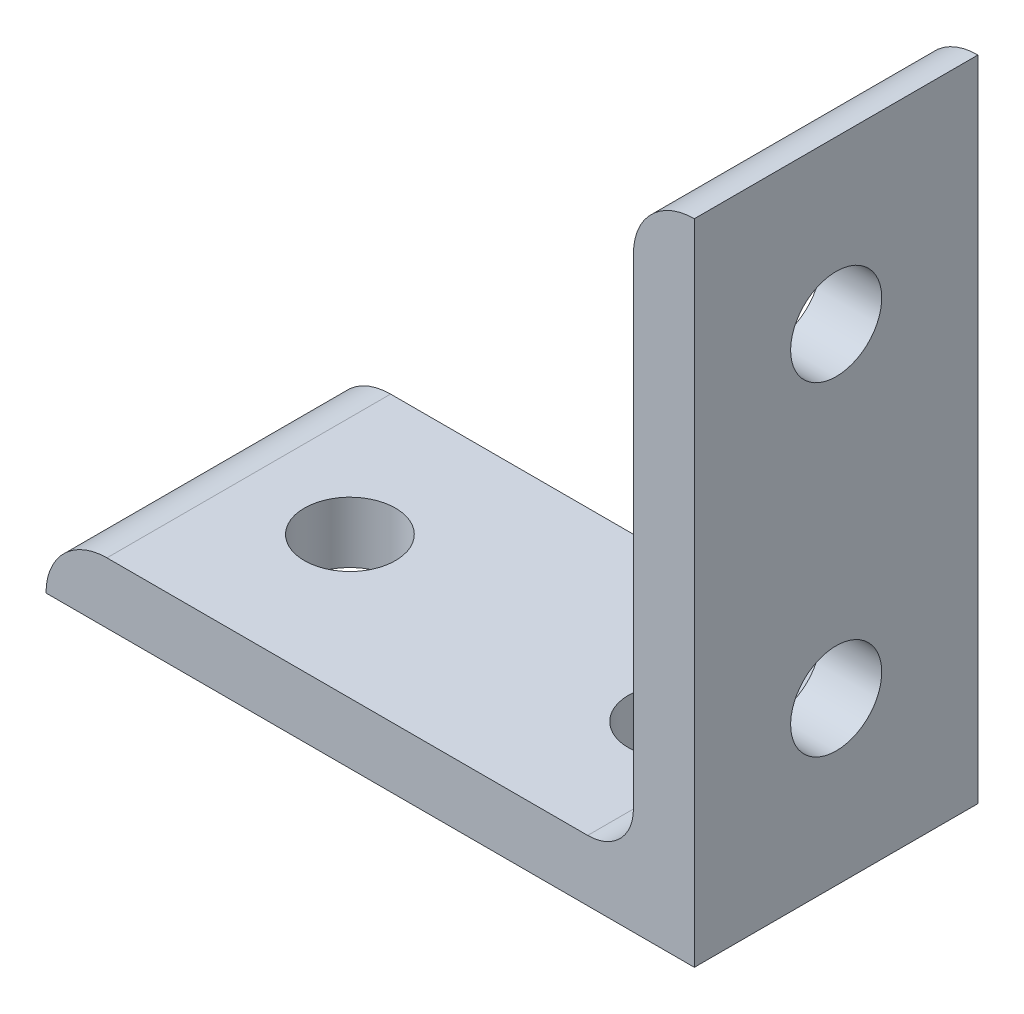
ISO-10303-21;
HEADER;
FILE_DESCRIPTION(('STEP AP214'),'2;1');
FILE_NAME('part.step','',(''),(''),'','','');
FILE_SCHEMA(('AUTOMOTIVE_DESIGN { 1 0 10303 214 1 1 1 1 }'));
ENDSEC;
DATA;
#1=APPLICATION_CONTEXT('core data for automotive mechanical design processes');
#2=APPLICATION_PROTOCOL_DEFINITION('international standard','automotive_design',2000,#1);
#3=PRODUCT_CONTEXT('',#1,'mechanical');
#4=PRODUCT('Part','Part','',(#3));
#5=PRODUCT_RELATED_PRODUCT_CATEGORY('part','',(#4));
#6=PRODUCT_DEFINITION_FORMATION('','',#4);
#7=PRODUCT_DEFINITION_CONTEXT('part definition',#1,'design');
#8=PRODUCT_DEFINITION('design','',#6,#7);
#9=PRODUCT_DEFINITION_SHAPE('','',#8);
#10=(LENGTH_UNIT() NAMED_UNIT(*) SI_UNIT(.MILLI.,.METRE.));
#11=(NAMED_UNIT(*) PLANE_ANGLE_UNIT() SI_UNIT($,.RADIAN.));
#12=(NAMED_UNIT(*) SI_UNIT($,.STERADIAN.) SOLID_ANGLE_UNIT());
#13=UNCERTAINTY_MEASURE_WITH_UNIT(LENGTH_MEASURE(1.E-05),#10,'distance_accuracy_value','');
#14=(GEOMETRIC_REPRESENTATION_CONTEXT(3) GLOBAL_UNCERTAINTY_ASSIGNED_CONTEXT((#13)) GLOBAL_UNIT_ASSIGNED_CONTEXT((#10,
#11,#12)) REPRESENTATION_CONTEXT('',''));
#15=CARTESIAN_POINT('',(0.,0.,0.));
#16=DIRECTION('',(0.,0.,1.));
#17=DIRECTION('',(1.,0.,0.));
#18=AXIS2_PLACEMENT_3D('',#15,#16,#17);
#19=CARTESIAN_POINT('',(0.,0.,-11.1125));
#20=DIRECTION('',(0.,-1.,0.));
#21=DIRECTION('',(1.,0.,0.));
#22=AXIS2_PLACEMENT_3D('',#19,#20,#21);
#23=PLANE('',#22);
#24=CARTESIAN_POINT('',(-38.1,0.,0.));
#25=DIRECTION('',(0.,1.,0.));
#26=DIRECTION('',(-1.,0.,0.));
#27=AXIS2_PLACEMENT_3D('',#24,#25,#26);
#28=CIRCLE('',#27,3.5687);
#29=CARTESIAN_POINT('',(-41.6687,0.,0.));
#30=VERTEX_POINT('',#29);
#31=EDGE_CURVE('E192',#30,#30,#28,.T.);
#32=ORIENTED_EDGE('',*,*,#31,.T.);
#33=EDGE_LOOP('',(#32));
#34=FACE_BOUND('',#33,.T.);
#35=CARTESIAN_POINT('',(-12.7,0.,0.));
#36=DIRECTION('',(0.,1.,0.));
#37=DIRECTION('',(-1.,0.,0.));
#38=AXIS2_PLACEMENT_3D('',#35,#36,#37);
#39=CIRCLE('',#38,3.5687);
#40=CARTESIAN_POINT('',(-16.2687,0.,0.));
#41=VERTEX_POINT('',#40);
#42=EDGE_CURVE('E129',#41,#41,#39,.T.);
#43=ORIENTED_EDGE('',*,*,#42,.T.);
#44=EDGE_LOOP('',(#43));
#45=FACE_BOUND('',#44,.T.);
#46=DIRECTION('',(1.,0.,0.));
#47=VECTOR('',#46,1.);
#48=CARTESIAN_POINT('',(0.,0.,11.1125));
#49=LINE('',#48,#47);
#50=CARTESIAN_POINT('',(-50.8,0.,11.1125));
#51=VERTEX_POINT('',#50);
#52=CARTESIAN_POINT('',(0.,0.,11.1125));
#53=VERTEX_POINT('',#52);
#54=EDGE_CURVE('E125',#51,#53,#49,.T.);
#55=ORIENTED_EDGE('',*,*,#54,.F.);
#56=DIRECTION('',(0.,0.,1.));
#57=VECTOR('',#56,1.);
#58=CARTESIAN_POINT('',(-50.8,0.,-11.1125));
#59=LINE('',#58,#57);
#60=CARTESIAN_POINT('',(-50.8,0.,-11.1125));
#61=VERTEX_POINT('',#60);
#62=EDGE_CURVE('E11',#61,#51,#59,.T.);
#63=ORIENTED_EDGE('',*,*,#62,.F.);
#64=DIRECTION('',(1.,0.,0.));
#65=VECTOR('',#64,1.);
#66=CARTESIAN_POINT('',(0.,0.,-11.1125));
#67=LINE('',#66,#65);
#68=CARTESIAN_POINT('',(0.,0.,-11.1125));
#69=VERTEX_POINT('',#68);
#70=EDGE_CURVE('E143',#61,#69,#67,.T.);
#71=ORIENTED_EDGE('',*,*,#70,.T.);
#72=DIRECTION('',(0.,0.,1.));
#73=VECTOR('',#72,1.);
#74=CARTESIAN_POINT('',(0.,0.,-11.1125));
#75=LINE('',#74,#73);
#76=EDGE_CURVE('E37',#69,#53,#75,.T.);
#77=ORIENTED_EDGE('',*,*,#76,.T.);
#78=EDGE_LOOP('',(#55,#63,#71,#77));
#79=FACE_BOUND('',#78,.T.);
#80=ADVANCED_FACE('F34',(#34,#45,#79),#23,.T.);
#81=CARTESIAN_POINT('',(-46.0248,0.,-11.1125));
#82=DIRECTION('',(0.,0.,1.));
#83=DIRECTION('',(1.,0.,0.));
#84=AXIS2_PLACEMENT_3D('',#81,#82,#83);
#85=CYLINDRICAL_SURFACE('',#84,4.77519999999999);
#86=CARTESIAN_POINT('',(-46.0248,0.,11.1125));
#87=DIRECTION('',(0.,0.,1.));
#88=DIRECTION('',(-1.,0.,0.));
#89=AXIS2_PLACEMENT_3D('',#86,#87,#88);
#90=CIRCLE('',#89,4.77519999999999);
#91=CARTESIAN_POINT('',(-46.0248,4.77519999999999,11.1125));
#92=VERTEX_POINT('',#91);
#93=EDGE_CURVE('E141',#92,#51,#90,.T.);
#94=ORIENTED_EDGE('',*,*,#93,.F.);
#95=DIRECTION('',(0.,0.,1.));
#96=VECTOR('',#95,1.);
#97=CARTESIAN_POINT('',(-46.0248,4.77519999999999,-11.1125));
#98=LINE('',#97,#96);
#99=CARTESIAN_POINT('',(-46.0248,4.77519999999999,-11.1125));
#100=VERTEX_POINT('',#99);
#101=EDGE_CURVE('E43',#100,#92,#98,.T.);
#102=ORIENTED_EDGE('',*,*,#101,.F.);
#103=CARTESIAN_POINT('',(-46.0248,0.,-11.1125));
#104=DIRECTION('',(0.,0.,1.));
#105=DIRECTION('',(-1.,0.,0.));
#106=AXIS2_PLACEMENT_3D('',#103,#104,#105);
#107=CIRCLE('',#106,4.77519999999999);
#108=EDGE_CURVE('E115',#100,#61,#107,.T.);
#109=ORIENTED_EDGE('',*,*,#108,.T.);
#110=ORIENTED_EDGE('',*,*,#62,.T.);
#111=EDGE_LOOP('',(#94,#102,#109,#110));
#112=FACE_BOUND('',#111,.T.);
#113=ADVANCED_FACE('F153',(#112),#85,.T.);
#114=CARTESIAN_POINT('',(-46.0248,4.77519999999999,-11.1125));
#115=DIRECTION('',(0.,1.,0.));
#116=DIRECTION('',(-1.,0.,0.));
#117=AXIS2_PLACEMENT_3D('',#114,#115,#116);
#118=PLANE('',#117);
#119=CARTESIAN_POINT('',(-38.1,4.7752,0.));
#120=DIRECTION('',(0.,1.,0.));
#121=DIRECTION('',(-1.,0.,0.));
#122=AXIS2_PLACEMENT_3D('',#119,#120,#121);
#123=CIRCLE('',#122,3.5687);
#124=CARTESIAN_POINT('',(-41.6687,4.7752,0.));
#125=VERTEX_POINT('',#124);
#126=EDGE_CURVE('E188',#125,#125,#123,.T.);
#127=ORIENTED_EDGE('',*,*,#126,.F.);
#128=EDGE_LOOP('',(#127));
#129=FACE_BOUND('',#128,.T.);
#130=CARTESIAN_POINT('',(-12.7,4.7752,0.));
#131=DIRECTION('',(0.,1.,0.));
#132=DIRECTION('',(-1.,0.,0.));
#133=AXIS2_PLACEMENT_3D('',#130,#131,#132);
#134=CIRCLE('',#133,3.5687);
#135=CARTESIAN_POINT('',(-16.2687,4.7752,0.));
#136=VERTEX_POINT('',#135);
#137=EDGE_CURVE('E201',#136,#136,#134,.T.);
#138=ORIENTED_EDGE('',*,*,#137,.F.);
#139=EDGE_LOOP('',(#138));
#140=FACE_BOUND('',#139,.T.);
#141=DIRECTION('',(-1.,0.,0.));
#142=VECTOR('',#141,1.);
#143=CARTESIAN_POINT('',(-46.0248,4.77519999999999,11.1125));
#144=LINE('',#143,#142);
#145=CARTESIAN_POINT('',(-8.3566,4.7752,11.1125));
#146=VERTEX_POINT('',#145);
#147=EDGE_CURVE('E102',#146,#92,#144,.T.);
#148=ORIENTED_EDGE('',*,*,#147,.F.);
#149=DIRECTION('',(0.,0.,1.));
#150=VECTOR('',#149,1.);
#151=CARTESIAN_POINT('',(-8.3566,4.7752,-11.1125));
#152=LINE('',#151,#150);
#153=CARTESIAN_POINT('',(-8.3566,4.7752,-11.1125));
#154=VERTEX_POINT('',#153);
#155=EDGE_CURVE('E97',#154,#146,#152,.T.);
#156=ORIENTED_EDGE('',*,*,#155,.F.);
#157=DIRECTION('',(-1.,0.,0.));
#158=VECTOR('',#157,1.);
#159=CARTESIAN_POINT('',(-46.0248,4.77519999999999,-11.1125));
#160=LINE('',#159,#158);
#161=EDGE_CURVE('E100',#154,#100,#160,.T.);
#162=ORIENTED_EDGE('',*,*,#161,.T.);
#163=ORIENTED_EDGE('',*,*,#101,.T.);
#164=EDGE_LOOP('',(#148,#156,#162,#163));
#165=FACE_BOUND('',#164,.T.);
#166=ADVANCED_FACE('F99',(#129,#140,#165),#118,.T.);
#167=CARTESIAN_POINT('',(-8.3566,8.35659999999999,-11.1125));
#168=DIRECTION('',(0.,0.,1.));
#169=DIRECTION('',(1.,0.,0.));
#170=AXIS2_PLACEMENT_3D('',#167,#168,#169);
#171=CYLINDRICAL_SURFACE('',#170,3.5814);
#172=CARTESIAN_POINT('',(-8.3566,8.35659999999999,11.1125));
#173=DIRECTION('',(0.,0.,-1.));
#174=DIRECTION('',(1.,0.,0.));
#175=AXIS2_PLACEMENT_3D('',#172,#173,#174);
#176=CIRCLE('',#175,3.5814);
#177=CARTESIAN_POINT('',(-4.7752,8.35659999999999,11.1125));
#178=VERTEX_POINT('',#177);
#179=EDGE_CURVE('E138',#178,#146,#176,.T.);
#180=ORIENTED_EDGE('',*,*,#179,.F.);
#181=DIRECTION('',(0.,0.,1.));
#182=VECTOR('',#181,1.);
#183=CARTESIAN_POINT('',(-4.7752,8.35659999999999,-11.1125));
#184=LINE('',#183,#182);
#185=CARTESIAN_POINT('',(-4.7752,8.35659999999999,-11.1125));
#186=VERTEX_POINT('',#185);
#187=EDGE_CURVE('E107',#186,#178,#184,.T.);
#188=ORIENTED_EDGE('',*,*,#187,.F.);
#189=CARTESIAN_POINT('',(-8.3566,8.35659999999999,-11.1125));
#190=DIRECTION('',(0.,0.,-1.));
#191=DIRECTION('',(1.,0.,0.));
#192=AXIS2_PLACEMENT_3D('',#189,#190,#191);
#193=CIRCLE('',#192,3.5814);
#194=EDGE_CURVE('E113',#186,#154,#193,.T.);
#195=ORIENTED_EDGE('',*,*,#194,.T.);
#196=ORIENTED_EDGE('',*,*,#155,.T.);
#197=EDGE_LOOP('',(#180,#188,#195,#196));
#198=FACE_BOUND('',#197,.T.);
#199=ADVANCED_FACE('F117',(#198),#171,.F.);
#200=CARTESIAN_POINT('',(-4.7752,8.35659999999999,-11.1125));
#201=DIRECTION('',(-1.,0.,0.));
#202=DIRECTION('',(0.,0.,1.));
#203=AXIS2_PLACEMENT_3D('',#200,#201,#202);
#204=PLANE('',#203);
#205=CARTESIAN_POINT('',(-4.7752,12.7,0.));
#206=DIRECTION('',(-1.,0.,0.));
#207=DIRECTION('',(0.,-1.,0.));
#208=AXIS2_PLACEMENT_3D('',#205,#206,#207);
#209=CIRCLE('',#208,3.5687);
#210=CARTESIAN_POINT('',(-4.7752,9.1313,0.));
#211=VERTEX_POINT('',#210);
#212=EDGE_CURVE('E197',#211,#211,#209,.T.);
#213=ORIENTED_EDGE('',*,*,#212,.F.);
#214=EDGE_LOOP('',(#213));
#215=FACE_BOUND('',#214,.T.);
#216=CARTESIAN_POINT('',(-4.7752,38.1,0.));
#217=DIRECTION('',(-1.,0.,0.));
#218=DIRECTION('',(0.,-1.,0.));
#219=AXIS2_PLACEMENT_3D('',#216,#217,#218);
#220=CIRCLE('',#219,3.56870000000001);
#221=CARTESIAN_POINT('',(-4.7752,34.5313,0.));
#222=VERTEX_POINT('',#221);
#223=EDGE_CURVE('E189',#222,#222,#220,.T.);
#224=ORIENTED_EDGE('',*,*,#223,.F.);
#225=EDGE_LOOP('',(#224));
#226=FACE_BOUND('',#225,.T.);
#227=DIRECTION('',(0.,-1.,0.));
#228=VECTOR('',#227,1.);
#229=CARTESIAN_POINT('',(-4.7752,8.35659999999999,11.1125));
#230=LINE('',#229,#228);
#231=CARTESIAN_POINT('',(-4.77519999999999,46.0248,11.1125));
#232=VERTEX_POINT('',#231);
#233=EDGE_CURVE('E135',#232,#178,#230,.T.);
#234=ORIENTED_EDGE('',*,*,#233,.F.);
#235=DIRECTION('',(0.,0.,1.));
#236=VECTOR('',#235,1.);
#237=CARTESIAN_POINT('',(-4.77519999999999,46.0248,-11.1125));
#238=LINE('',#237,#236);
#239=CARTESIAN_POINT('',(-4.77519999999999,46.0248,-11.1125));
#240=VERTEX_POINT('',#239);
#241=EDGE_CURVE('E147',#240,#232,#238,.T.);
#242=ORIENTED_EDGE('',*,*,#241,.F.);
#243=DIRECTION('',(0.,-1.,0.));
#244=VECTOR('',#243,1.);
#245=CARTESIAN_POINT('',(-4.7752,8.35659999999999,-11.1125));
#246=LINE('',#245,#244);
#247=EDGE_CURVE('E118',#240,#186,#246,.T.);
#248=ORIENTED_EDGE('',*,*,#247,.T.);
#249=ORIENTED_EDGE('',*,*,#187,.T.);
#250=EDGE_LOOP('',(#234,#242,#248,#249));
#251=FACE_BOUND('',#250,.T.);
#252=ADVANCED_FACE('F168',(#215,#226,#251),#204,.T.);
#253=CARTESIAN_POINT('',(0.,46.0248,-11.1125));
#254=DIRECTION('',(0.,0.,1.));
#255=DIRECTION('',(1.,0.,0.));
#256=AXIS2_PLACEMENT_3D('',#253,#254,#255);
#257=CYLINDRICAL_SURFACE('',#256,4.77519999999999);
#258=CARTESIAN_POINT('',(0.,46.0248,11.1125));
#259=DIRECTION('',(0.,0.,1.));
#260=DIRECTION('',(-1.,0.,0.));
#261=AXIS2_PLACEMENT_3D('',#258,#259,#260);
#262=CIRCLE('',#261,4.77519999999999);
#263=CARTESIAN_POINT('',(0.,50.8,11.1125));
#264=VERTEX_POINT('',#263);
#265=EDGE_CURVE('E132',#264,#232,#262,.T.);
#266=ORIENTED_EDGE('',*,*,#265,.F.);
#267=DIRECTION('',(0.,0.,1.));
#268=VECTOR('',#267,1.);
#269=CARTESIAN_POINT('',(0.,50.8,-11.1125));
#270=LINE('',#269,#268);
#271=CARTESIAN_POINT('',(0.,50.8,-11.1125));
#272=VERTEX_POINT('',#271);
#273=EDGE_CURVE('E148',#272,#264,#270,.T.);
#274=ORIENTED_EDGE('',*,*,#273,.F.);
#275=CARTESIAN_POINT('',(0.,46.0248,-11.1125));
#276=DIRECTION('',(0.,0.,1.));
#277=DIRECTION('',(-1.,0.,0.));
#278=AXIS2_PLACEMENT_3D('',#275,#276,#277);
#279=CIRCLE('',#278,4.77519999999999);
#280=EDGE_CURVE('E120',#272,#240,#279,.T.);
#281=ORIENTED_EDGE('',*,*,#280,.T.);
#282=ORIENTED_EDGE('',*,*,#241,.T.);
#283=EDGE_LOOP('',(#266,#274,#281,#282));
#284=FACE_BOUND('',#283,.T.);
#285=ADVANCED_FACE('F171',(#284),#257,.T.);
#286=CARTESIAN_POINT('',(0.,0.,-11.1125));
#287=DIRECTION('',(1.,0.,0.));
#288=DIRECTION('',(0.,0.,-1.));
#289=AXIS2_PLACEMENT_3D('',#286,#287,#288);
#290=PLANE('',#289);
#291=CARTESIAN_POINT('',(0.,12.7,0.));
#292=DIRECTION('',(-1.,0.,0.));
#293=DIRECTION('',(0.,-1.,0.));
#294=AXIS2_PLACEMENT_3D('',#291,#292,#293);
#295=CIRCLE('',#294,3.5687);
#296=CARTESIAN_POINT('',(0.,9.1313,0.));
#297=VERTEX_POINT('',#296);
#298=EDGE_CURVE('E183',#297,#297,#295,.T.);
#299=ORIENTED_EDGE('',*,*,#298,.T.);
#300=EDGE_LOOP('',(#299));
#301=FACE_BOUND('',#300,.T.);
#302=CARTESIAN_POINT('',(0.,38.1,0.));
#303=DIRECTION('',(-1.,0.,0.));
#304=DIRECTION('',(0.,-1.,0.));
#305=AXIS2_PLACEMENT_3D('',#302,#303,#304);
#306=CIRCLE('',#305,3.56870000000001);
#307=CARTESIAN_POINT('',(0.,34.5313,0.));
#308=VERTEX_POINT('',#307);
#309=EDGE_CURVE('E186',#308,#308,#306,.T.);
#310=ORIENTED_EDGE('',*,*,#309,.T.);
#311=EDGE_LOOP('',(#310));
#312=FACE_BOUND('',#311,.T.);
#313=DIRECTION('',(0.,1.,0.));
#314=VECTOR('',#313,1.);
#315=CARTESIAN_POINT('',(0.,0.,11.1125));
#316=LINE('',#315,#314);
#317=EDGE_CURVE('E128',#53,#264,#316,.T.);
#318=ORIENTED_EDGE('',*,*,#317,.F.);
#319=ORIENTED_EDGE('',*,*,#76,.F.);
#320=DIRECTION('',(0.,1.,0.));
#321=VECTOR('',#320,1.);
#322=CARTESIAN_POINT('',(0.,0.,-11.1125));
#323=LINE('',#322,#321);
#324=EDGE_CURVE('E208',#69,#272,#323,.T.);
#325=ORIENTED_EDGE('',*,*,#324,.T.);
#326=ORIENTED_EDGE('',*,*,#273,.T.);
#327=EDGE_LOOP('',(#318,#319,#325,#326));
#328=FACE_BOUND('',#327,.T.);
#329=ADVANCED_FACE('F150',(#301,#312,#328),#290,.T.);
#330=CARTESIAN_POINT('',(-46.0248,0.,-11.1125));
#331=DIRECTION('',(0.,0.,-1.));
#332=DIRECTION('',(-1.,0.,0.));
#333=AXIS2_PLACEMENT_3D('',#330,#331,#332);
#334=PLANE('',#333);
#335=ORIENTED_EDGE('',*,*,#70,.F.);
#336=ORIENTED_EDGE('',*,*,#108,.F.);
#337=ORIENTED_EDGE('',*,*,#161,.F.);
#338=ORIENTED_EDGE('',*,*,#194,.F.);
#339=ORIENTED_EDGE('',*,*,#247,.F.);
#340=ORIENTED_EDGE('',*,*,#280,.F.);
#341=ORIENTED_EDGE('',*,*,#324,.F.);
#342=EDGE_LOOP('',(#335,#336,#337,#338,#339,#340,#341));
#343=FACE_BOUND('',#342,.T.);
#344=ADVANCED_FACE('F111',(#343),#334,.T.);
#345=CARTESIAN_POINT('',(-46.0248,0.,11.1125));
#346=DIRECTION('',(0.,0.,-1.));
#347=DIRECTION('',(-1.,0.,0.));
#348=AXIS2_PLACEMENT_3D('',#345,#346,#347);
#349=PLANE('',#348);
#350=ORIENTED_EDGE('',*,*,#54,.T.);
#351=ORIENTED_EDGE('',*,*,#317,.T.);
#352=ORIENTED_EDGE('',*,*,#265,.T.);
#353=ORIENTED_EDGE('',*,*,#233,.T.);
#354=ORIENTED_EDGE('',*,*,#179,.T.);
#355=ORIENTED_EDGE('',*,*,#147,.T.);
#356=ORIENTED_EDGE('',*,*,#93,.T.);
#357=EDGE_LOOP('',(#350,#351,#352,#353,#354,#355,#356));
#358=FACE_BOUND('',#357,.T.);
#359=ADVANCED_FACE('F152',(#358),#349,.F.);
#360=CARTESIAN_POINT('',(-12.7,0.,0.));
#361=DIRECTION('',(0.,1.,0.));
#362=DIRECTION('',(-1.,0.,0.));
#363=AXIS2_PLACEMENT_3D('',#360,#361,#362);
#364=CYLINDRICAL_SURFACE('',#363,3.5687);
#365=ORIENTED_EDGE('',*,*,#42,.F.);
#366=EDGE_LOOP('',(#365));
#367=FACE_BOUND('',#366,.T.);
#368=ORIENTED_EDGE('',*,*,#137,.T.);
#369=EDGE_LOOP('',(#368));
#370=FACE_BOUND('',#369,.T.);
#371=ADVANCED_FACE('F215',(#367,#370),#364,.F.);
#372=CARTESIAN_POINT('',(-38.1,0.,0.));
#373=DIRECTION('',(0.,1.,0.));
#374=DIRECTION('',(-1.,0.,0.));
#375=AXIS2_PLACEMENT_3D('',#372,#373,#374);
#376=CYLINDRICAL_SURFACE('',#375,3.5687);
#377=ORIENTED_EDGE('',*,*,#31,.F.);
#378=EDGE_LOOP('',(#377));
#379=FACE_BOUND('',#378,.T.);
#380=ORIENTED_EDGE('',*,*,#126,.T.);
#381=EDGE_LOOP('',(#380));
#382=FACE_BOUND('',#381,.T.);
#383=ADVANCED_FACE('F218',(#379,#382),#376,.F.);
#384=CARTESIAN_POINT('',(0.,38.1,0.));
#385=DIRECTION('',(-1.,0.,0.));
#386=DIRECTION('',(0.,-1.,0.));
#387=AXIS2_PLACEMENT_3D('',#384,#385,#386);
#388=CYLINDRICAL_SURFACE('',#387,3.56870000000001);
#389=ORIENTED_EDGE('',*,*,#309,.F.);
#390=EDGE_LOOP('',(#389));
#391=FACE_BOUND('',#390,.T.);
#392=ORIENTED_EDGE('',*,*,#223,.T.);
#393=EDGE_LOOP('',(#392));
#394=FACE_BOUND('',#393,.T.);
#395=ADVANCED_FACE('F225',(#391,#394),#388,.F.);
#396=CARTESIAN_POINT('',(0.,12.7,0.));
#397=DIRECTION('',(-1.,0.,0.));
#398=DIRECTION('',(0.,-1.,0.));
#399=AXIS2_PLACEMENT_3D('',#396,#397,#398);
#400=CYLINDRICAL_SURFACE('',#399,3.5687);
#401=ORIENTED_EDGE('',*,*,#298,.F.);
#402=EDGE_LOOP('',(#401));
#403=FACE_BOUND('',#402,.T.);
#404=ORIENTED_EDGE('',*,*,#212,.T.);
#405=EDGE_LOOP('',(#404));
#406=FACE_BOUND('',#405,.T.);
#407=ADVANCED_FACE('F232',(#403,#406),#400,.F.);
#408=CLOSED_SHELL('',(#80,#113,#166,#199,#252,#285,#329,#344,#359,#371,#383,#395,#407));
#409=MANIFOLD_SOLID_BREP('B2',#408);
#410=ADVANCED_BREP_SHAPE_REPRESENTATION('',(#18,#409),#14);
#411=SHAPE_DEFINITION_REPRESENTATION(#9,#410);
ENDSEC;
END-ISO-10303-21;
